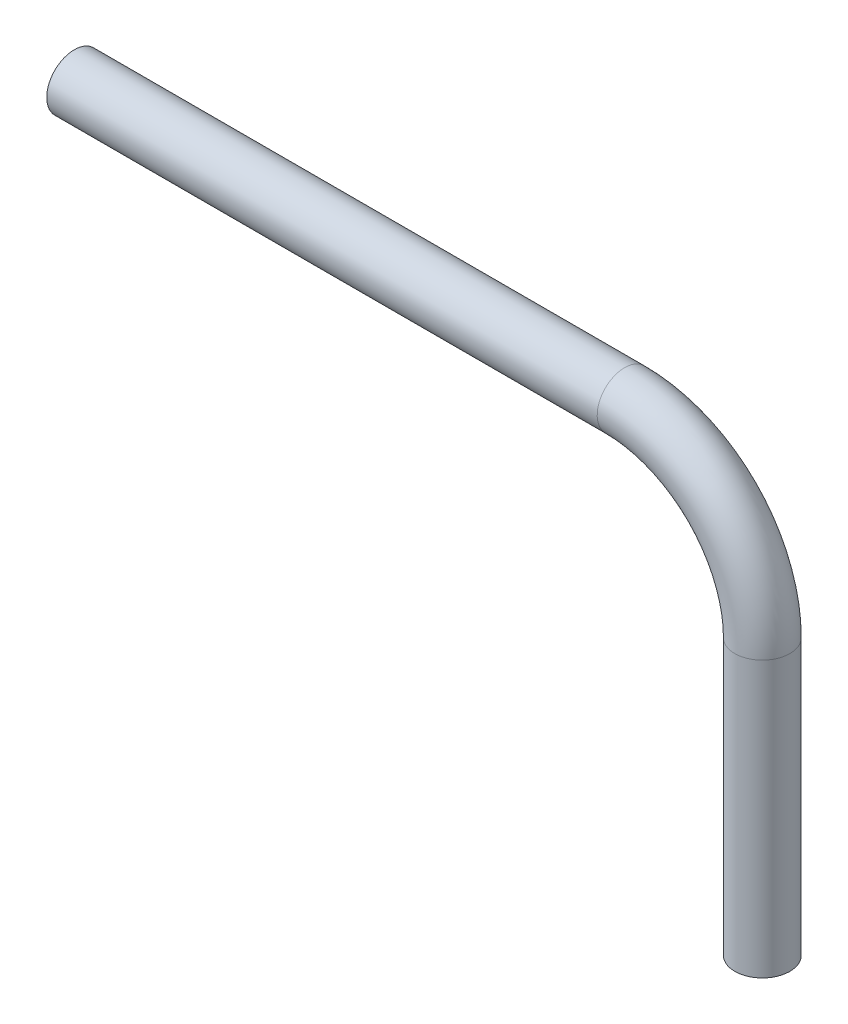
ISO-10303-21;
HEADER;
FILE_DESCRIPTION(('STEP AP214'),'2;1');
FILE_NAME('part.step','',(''),(''),'','','');
FILE_SCHEMA(('AUTOMOTIVE_DESIGN { 1 0 10303 214 1 1 1 1 }'));
ENDSEC;
DATA;
#1=APPLICATION_CONTEXT('core data for automotive mechanical design processes');
#2=APPLICATION_PROTOCOL_DEFINITION('international standard','automotive_design',2000,#1);
#3=PRODUCT_CONTEXT('',#1,'mechanical');
#4=PRODUCT('Part','Part','',(#3));
#5=PRODUCT_RELATED_PRODUCT_CATEGORY('part','',(#4));
#6=PRODUCT_DEFINITION_FORMATION('','',#4);
#7=PRODUCT_DEFINITION_CONTEXT('part definition',#1,'design');
#8=PRODUCT_DEFINITION('design','',#6,#7);
#9=PRODUCT_DEFINITION_SHAPE('','',#8);
#10=(LENGTH_UNIT() NAMED_UNIT(*) SI_UNIT(.MILLI.,.METRE.));
#11=(NAMED_UNIT(*) PLANE_ANGLE_UNIT() SI_UNIT($,.RADIAN.));
#12=(NAMED_UNIT(*) SI_UNIT($,.STERADIAN.) SOLID_ANGLE_UNIT());
#13=UNCERTAINTY_MEASURE_WITH_UNIT(LENGTH_MEASURE(1.E-05),#10,'distance_accuracy_value','');
#14=(GEOMETRIC_REPRESENTATION_CONTEXT(3) GLOBAL_UNCERTAINTY_ASSIGNED_CONTEXT((#13)) GLOBAL_UNIT_ASSIGNED_CONTEXT((#10,
#11,#12)) REPRESENTATION_CONTEXT('',''));
#15=CARTESIAN_POINT('',(0.,0.,0.));
#16=DIRECTION('',(0.,0.,1.));
#17=DIRECTION('',(1.,0.,0.));
#18=AXIS2_PLACEMENT_3D('',#15,#16,#17);
#19=CARTESIAN_POINT('',(0.,0.,0.));
#20=DIRECTION('',(1.,0.,0.));
#21=DIRECTION('',(0.,0.,-1.));
#22=AXIS2_PLACEMENT_3D('',#19,#20,#21);
#23=PLANE('',#22);
#24=CARTESIAN_POINT('',(0.,0.,0.));
#25=DIRECTION('',(1.,0.,0.));
#26=DIRECTION('',(0.,0.,-1.));
#27=AXIS2_PLACEMENT_3D('',#24,#25,#26);
#28=CIRCLE('',#27,5.);
#29=CARTESIAN_POINT('',(0.,0.,-5.));
#30=VERTEX_POINT('',#29);
#31=EDGE_CURVE('E54',#30,#30,#28,.T.);
#32=ORIENTED_EDGE('',*,*,#31,.F.);
#33=EDGE_LOOP('',(#32));
#34=FACE_BOUND('',#33,.T.);
#35=ADVANCED_FACE('F37',(#34),#23,.F.);
#36=CARTESIAN_POINT('',(125.,-75.,0.));
#37=DIRECTION('',(0.,-1.,0.));
#38=DIRECTION('',(0.,0.,-1.));
#39=AXIS2_PLACEMENT_3D('',#36,#37,#38);
#40=PLANE('',#39);
#41=CARTESIAN_POINT('',(125.,-75.,0.));
#42=DIRECTION('',(0.,-1.,0.));
#43=DIRECTION('',(0.,0.,-1.));
#44=AXIS2_PLACEMENT_3D('',#41,#42,#43);
#45=CIRCLE('',#44,5.);
#46=CARTESIAN_POINT('',(125.,-75.,-5.));
#47=VERTEX_POINT('',#46);
#48=EDGE_CURVE('E10',#47,#47,#45,.T.);
#49=ORIENTED_EDGE('',*,*,#48,.T.);
#50=EDGE_LOOP('',(#49));
#51=FACE_BOUND('',#50,.T.);
#52=ADVANCED_FACE('F64',(#51),#40,.T.);
#53=CARTESIAN_POINT('',(0.,0.,0.));
#54=DIRECTION('',(1.,0.,0.));
#55=DIRECTION('',(0.,0.,-1.));
#56=AXIS2_PLACEMENT_3D('',#53,#54,#55);
#57=CYLINDRICAL_SURFACE('',#56,5.);
#58=CARTESIAN_POINT('',(100.,0.,0.));
#59=DIRECTION('',(1.,0.,0.));
#60=DIRECTION('',(0.,0.,-1.));
#61=AXIS2_PLACEMENT_3D('',#58,#59,#60);
#62=CIRCLE('',#61,5.);
#63=CARTESIAN_POINT('',(100.,5.,0.));
#64=VERTEX_POINT('',#63);
#65=EDGE_CURVE('E49',#64,#64,#62,.T.);
#66=ORIENTED_EDGE('',*,*,#65,.F.);
#67=EDGE_LOOP('',(#66));
#68=FACE_BOUND('',#67,.T.);
#69=ORIENTED_EDGE('',*,*,#31,.T.);
#70=EDGE_LOOP('',(#69));
#71=FACE_BOUND('',#70,.T.);
#72=ADVANCED_FACE('F61',(#68,#71),#57,.T.);
#73=CARTESIAN_POINT('',(100.,-25.,0.));
#74=DIRECTION('',(0.,0.,-1.));
#75=DIRECTION('',(-1.,0.,0.));
#76=AXIS2_PLACEMENT_3D('',#73,#74,#75);
#77=TOROIDAL_SURFACE('',#76,25.,5.);
#78=CARTESIAN_POINT('',(125.,-25.,0.));
#79=DIRECTION('',(0.,-1.,0.));
#80=DIRECTION('',(0.,0.,-1.));
#81=AXIS2_PLACEMENT_3D('',#78,#79,#80);
#82=CIRCLE('',#81,5.);
#83=CARTESIAN_POINT('',(130.,-25.,0.));
#84=VERTEX_POINT('',#83);
#85=EDGE_CURVE('E44',#84,#84,#82,.T.);
#86=CARTESIAN_POINT('',(100.,-25.,0.));
#87=DIRECTION('',(0.,0.,-1.));
#88=DIRECTION('',(-1.,0.,0.));
#89=AXIS2_PLACEMENT_3D('',#86,#87,#88);
#90=CIRCLE('',#89,30.);
#91=EDGE_CURVE('',#64,#84,#90,.T.);
#92=ORIENTED_EDGE('',*,*,#65,.T.);
#93=ORIENTED_EDGE('',*,*,#85,.F.);
#94=ORIENTED_EDGE('',*,*,#91,.T.);
#95=ORIENTED_EDGE('',*,*,#91,.F.);
#96=EDGE_LOOP('',(#92,#94,#93,#95));
#97=FACE_BOUND('',#96,.T.);
#98=ADVANCED_FACE('F70',(#97),#77,.T.);
#99=CARTESIAN_POINT('',(125.,-25.,0.));
#100=DIRECTION('',(0.,-1.,0.));
#101=DIRECTION('',(0.,0.,-1.));
#102=AXIS2_PLACEMENT_3D('',#99,#100,#101);
#103=CYLINDRICAL_SURFACE('',#102,5.);
#104=ORIENTED_EDGE('',*,*,#48,.F.);
#105=EDGE_LOOP('',(#104));
#106=FACE_BOUND('',#105,.T.);
#107=ORIENTED_EDGE('',*,*,#85,.T.);
#108=EDGE_LOOP('',(#107));
#109=FACE_BOUND('',#108,.T.);
#110=ADVANCED_FACE('F68',(#106,#109),#103,.T.);
#111=CLOSED_SHELL('',(#35,#52,#72,#98,#110));
#112=MANIFOLD_SOLID_BREP('B2',#111);
#113=ADVANCED_BREP_SHAPE_REPRESENTATION('',(#18,#112),#14);
#114=SHAPE_DEFINITION_REPRESENTATION(#9,#113);
ENDSEC;
END-ISO-10303-21;
